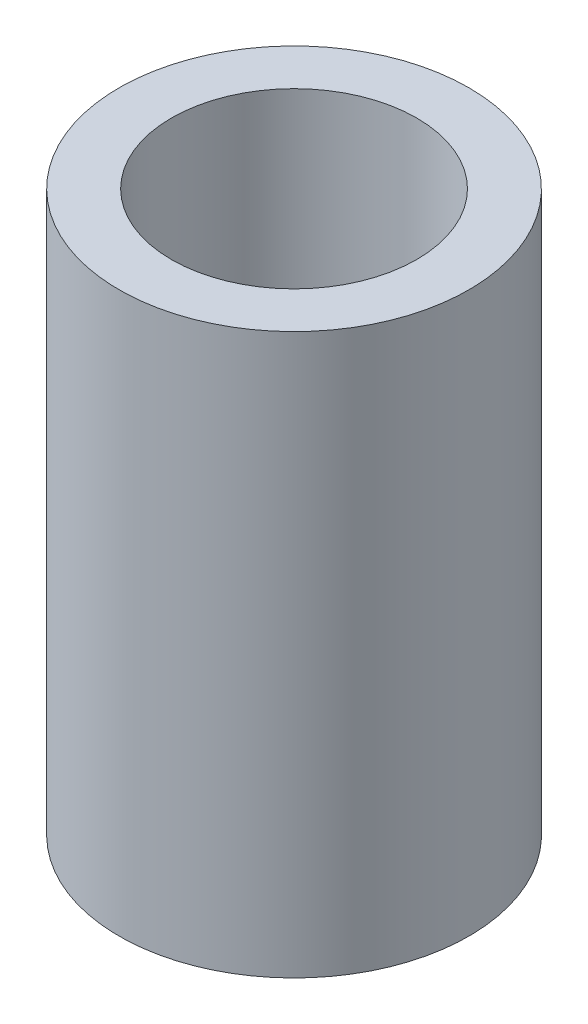
ISO-10303-21;
HEADER;
FILE_DESCRIPTION(('STEP AP214'),'2;1');
FILE_NAME('part.step','',(''),(''),'','','');
FILE_SCHEMA(('AUTOMOTIVE_DESIGN { 1 0 10303 214 1 1 1 1 }'));
ENDSEC;
DATA;
#1=APPLICATION_CONTEXT('core data for automotive mechanical design processes');
#2=APPLICATION_PROTOCOL_DEFINITION('international standard','automotive_design',2000,#1);
#3=PRODUCT_CONTEXT('',#1,'mechanical');
#4=PRODUCT('Part','Part','',(#3));
#5=PRODUCT_RELATED_PRODUCT_CATEGORY('part','',(#4));
#6=PRODUCT_DEFINITION_FORMATION('','',#4);
#7=PRODUCT_DEFINITION_CONTEXT('part definition',#1,'design');
#8=PRODUCT_DEFINITION('design','',#6,#7);
#9=PRODUCT_DEFINITION_SHAPE('','',#8);
#10=(LENGTH_UNIT() NAMED_UNIT(*) SI_UNIT(.MILLI.,.METRE.));
#11=(NAMED_UNIT(*) PLANE_ANGLE_UNIT() SI_UNIT($,.RADIAN.));
#12=(NAMED_UNIT(*) SI_UNIT($,.STERADIAN.) SOLID_ANGLE_UNIT());
#13=UNCERTAINTY_MEASURE_WITH_UNIT(LENGTH_MEASURE(1.E-05),#10,'distance_accuracy_value','');
#14=(GEOMETRIC_REPRESENTATION_CONTEXT(3) GLOBAL_UNCERTAINTY_ASSIGNED_CONTEXT((#13)) GLOBAL_UNIT_ASSIGNED_CONTEXT((#10,
#11,#12)) REPRESENTATION_CONTEXT('',''));
#15=CARTESIAN_POINT('',(0.,0.,0.));
#16=DIRECTION('',(0.,0.,1.));
#17=DIRECTION('',(1.,0.,0.));
#18=AXIS2_PLACEMENT_3D('',#15,#16,#17);
#19=CARTESIAN_POINT('',(0.,8.000000002,0.));
#20=DIRECTION('',(0.,-1.,0.));
#21=DIRECTION('',(0.,0.,-1.));
#22=AXIS2_PLACEMENT_3D('',#19,#20,#21);
#23=CYLINDRICAL_SURFACE('',#22,2.499995);
#24=CARTESIAN_POINT('',(0.,8.000000002,0.));
#25=DIRECTION('',(0.,-1.,0.));
#26=DIRECTION('',(0.,0.,-1.));
#27=AXIS2_PLACEMENT_3D('',#24,#25,#26);
#28=CIRCLE('',#27,2.499995);
#29=CARTESIAN_POINT('',(0.,8.000000002,-2.499995));
#30=VERTEX_POINT('',#29);
#31=EDGE_CURVE('E10',#30,#30,#28,.T.);
#32=ORIENTED_EDGE('',*,*,#31,.T.);
#33=EDGE_LOOP('',(#32));
#34=FACE_BOUND('',#33,.T.);
#35=CARTESIAN_POINT('',(0.,0.,0.));
#36=DIRECTION('',(0.,-1.,0.));
#37=DIRECTION('',(0.,0.,-1.));
#38=AXIS2_PLACEMENT_3D('',#35,#36,#37);
#39=CIRCLE('',#38,2.499995);
#40=CARTESIAN_POINT('',(0.,0.,-2.499995));
#41=VERTEX_POINT('',#40);
#42=EDGE_CURVE('E45',#41,#41,#39,.T.);
#43=ORIENTED_EDGE('',*,*,#42,.F.);
#44=EDGE_LOOP('',(#43));
#45=FACE_BOUND('',#44,.T.);
#46=ADVANCED_FACE('F31',(#34,#45),#23,.T.);
#47=CARTESIAN_POINT('',(2.499995,8.000000002,0.));
#48=DIRECTION('',(0.,1.,0.));
#49=DIRECTION('',(0.,0.,1.));
#50=AXIS2_PLACEMENT_3D('',#47,#48,#49);
#51=PLANE('',#50);
#52=CARTESIAN_POINT('',(0.,8.000000002,0.));
#53=DIRECTION('',(0.,-1.,0.));
#54=DIRECTION('',(0.,0.,-1.));
#55=AXIS2_PLACEMENT_3D('',#52,#53,#54);
#56=CIRCLE('',#55,1.7526);
#57=CARTESIAN_POINT('',(0.,8.000000002,-1.7526));
#58=VERTEX_POINT('',#57);
#59=EDGE_CURVE('E37',#58,#58,#56,.T.);
#60=ORIENTED_EDGE('',*,*,#59,.T.);
#61=EDGE_LOOP('',(#60));
#62=FACE_BOUND('',#61,.T.);
#63=ORIENTED_EDGE('',*,*,#31,.F.);
#64=EDGE_LOOP('',(#63));
#65=FACE_BOUND('',#64,.T.);
#66=ADVANCED_FACE('F55',(#62,#65),#51,.T.);
#67=CARTESIAN_POINT('',(0.,8.000000002,0.));
#68=DIRECTION('',(0.,-1.,0.));
#69=DIRECTION('',(0.,0.,-1.));
#70=AXIS2_PLACEMENT_3D('',#67,#68,#69);
#71=CYLINDRICAL_SURFACE('',#70,1.7526);
#72=CARTESIAN_POINT('',(0.,0.,0.));
#73=DIRECTION('',(0.,-1.,0.));
#74=DIRECTION('',(0.,0.,-1.));
#75=AXIS2_PLACEMENT_3D('',#72,#73,#74);
#76=CIRCLE('',#75,1.7526);
#77=CARTESIAN_POINT('',(0.,0.,-1.7526));
#78=VERTEX_POINT('',#77);
#79=EDGE_CURVE('E41',#78,#78,#76,.T.);
#80=ORIENTED_EDGE('',*,*,#79,.T.);
#81=EDGE_LOOP('',(#80));
#82=FACE_BOUND('',#81,.T.);
#83=ORIENTED_EDGE('',*,*,#59,.F.);
#84=EDGE_LOOP('',(#83));
#85=FACE_BOUND('',#84,.T.);
#86=ADVANCED_FACE('F59',(#82,#85),#71,.F.);
#87=CARTESIAN_POINT('',(1.7526,0.,0.));
#88=DIRECTION('',(0.,-1.,0.));
#89=DIRECTION('',(0.,0.,-1.));
#90=AXIS2_PLACEMENT_3D('',#87,#88,#89);
#91=PLANE('',#90);
#92=ORIENTED_EDGE('',*,*,#42,.T.);
#93=EDGE_LOOP('',(#92));
#94=FACE_BOUND('',#93,.T.);
#95=ORIENTED_EDGE('',*,*,#79,.F.);
#96=EDGE_LOOP('',(#95));
#97=FACE_BOUND('',#96,.T.);
#98=ADVANCED_FACE('F51',(#94,#97),#91,.T.);
#99=CLOSED_SHELL('',(#46,#66,#86,#98));
#100=MANIFOLD_SOLID_BREP('B2',#99);
#101=ADVANCED_BREP_SHAPE_REPRESENTATION('',(#18,#100),#14);
#102=SHAPE_DEFINITION_REPRESENTATION(#9,#101);
ENDSEC;
END-ISO-10303-21;
